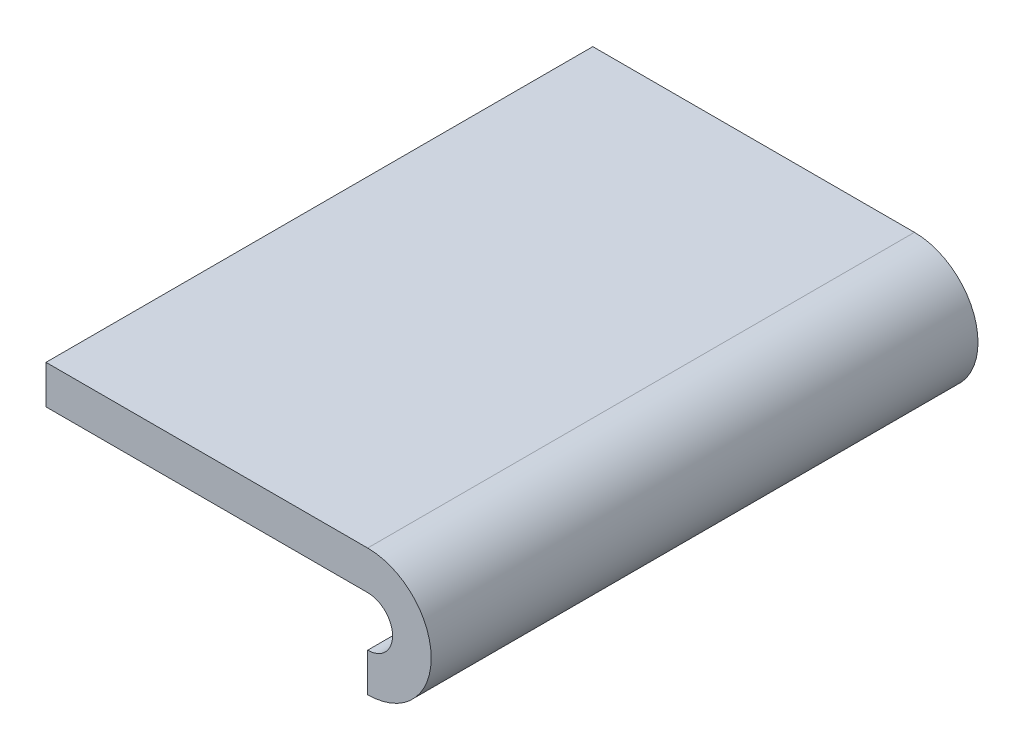
ISO-10303-21;
HEADER;
FILE_DESCRIPTION(('STEP AP214'),'2;1');
FILE_NAME('part.step','',(''),(''),'','','');
FILE_SCHEMA(('AUTOMOTIVE_DESIGN { 1 0 10303 214 1 1 1 1 }'));
ENDSEC;
DATA;
#1=APPLICATION_CONTEXT('core data for automotive mechanical design processes');
#2=APPLICATION_PROTOCOL_DEFINITION('international standard','automotive_design',2000,#1);
#3=PRODUCT_CONTEXT('',#1,'mechanical');
#4=PRODUCT('Part','Part','',(#3));
#5=PRODUCT_RELATED_PRODUCT_CATEGORY('part','',(#4));
#6=PRODUCT_DEFINITION_FORMATION('','',#4);
#7=PRODUCT_DEFINITION_CONTEXT('part definition',#1,'design');
#8=PRODUCT_DEFINITION('design','',#6,#7);
#9=PRODUCT_DEFINITION_SHAPE('','',#8);
#10=(LENGTH_UNIT() NAMED_UNIT(*) SI_UNIT(.MILLI.,.METRE.));
#11=(NAMED_UNIT(*) PLANE_ANGLE_UNIT() SI_UNIT($,.RADIAN.));
#12=(NAMED_UNIT(*) SI_UNIT($,.STERADIAN.) SOLID_ANGLE_UNIT());
#13=UNCERTAINTY_MEASURE_WITH_UNIT(LENGTH_MEASURE(1.E-05),#10,'distance_accuracy_value','');
#14=(GEOMETRIC_REPRESENTATION_CONTEXT(3) GLOBAL_UNCERTAINTY_ASSIGNED_CONTEXT((#13)) GLOBAL_UNIT_ASSIGNED_CONTEXT((#10,
#11,#12)) REPRESENTATION_CONTEXT('',''));
#15=CARTESIAN_POINT('',(0.,0.,0.));
#16=DIRECTION('',(0.,0.,1.));
#17=DIRECTION('',(1.,0.,0.));
#18=AXIS2_PLACEMENT_3D('',#15,#16,#17);
#19=CARTESIAN_POINT('',(0.,0.,170.));
#20=DIRECTION('',(0.,0.,-1.));
#21=DIRECTION('',(-1.,0.,0.));
#22=AXIS2_PLACEMENT_3D('',#19,#20,#21);
#23=CYLINDRICAL_SURFACE('',#22,7.75);
#24=CARTESIAN_POINT('',(0.,0.,0.));
#25=DIRECTION('',(0.,0.,-1.));
#26=DIRECTION('',(-1.,0.,0.));
#27=AXIS2_PLACEMENT_3D('',#24,#25,#26);
#28=CIRCLE('',#27,7.75);
#29=CARTESIAN_POINT('',(0.,7.75,0.));
#30=VERTEX_POINT('',#29);
#31=CARTESIAN_POINT('',(0.,-7.75,0.));
#32=VERTEX_POINT('',#31);
#33=EDGE_CURVE('E118',#30,#32,#28,.T.);
#34=ORIENTED_EDGE('',*,*,#33,.T.);
#35=DIRECTION('',(0.,0.,-1.));
#36=VECTOR('',#35,1.);
#37=CARTESIAN_POINT('',(0.,-7.75,170.));
#38=LINE('',#37,#36);
#39=CARTESIAN_POINT('',(0.,-7.75,170.));
#40=VERTEX_POINT('',#39);
#41=EDGE_CURVE('E11',#40,#32,#38,.T.);
#42=ORIENTED_EDGE('',*,*,#41,.F.);
#43=CARTESIAN_POINT('',(0.,0.,170.));
#44=DIRECTION('',(0.,0.,-1.));
#45=DIRECTION('',(-1.,0.,0.));
#46=AXIS2_PLACEMENT_3D('',#43,#44,#45);
#47=CIRCLE('',#46,7.75);
#48=CARTESIAN_POINT('',(0.,7.75,170.));
#49=VERTEX_POINT('',#48);
#50=EDGE_CURVE('E83',#49,#40,#47,.T.);
#51=ORIENTED_EDGE('',*,*,#50,.F.);
#52=DIRECTION('',(0.,0.,-1.));
#53=VECTOR('',#52,1.);
#54=CARTESIAN_POINT('',(0.,7.75,170.));
#55=LINE('',#54,#53);
#56=EDGE_CURVE('E114',#49,#30,#55,.T.);
#57=ORIENTED_EDGE('',*,*,#56,.T.);
#58=EDGE_LOOP('',(#34,#42,#51,#57));
#59=FACE_BOUND('',#58,.T.);
#60=ADVANCED_FACE('F37',(#59),#23,.F.);
#61=CARTESIAN_POINT('',(0.,-19.75,170.));
#62=DIRECTION('',(-1.,0.,0.));
#63=DIRECTION('',(0.,-1.,0.));
#64=AXIS2_PLACEMENT_3D('',#61,#62,#63);
#65=PLANE('',#64);
#66=DIRECTION('',(0.,1.,0.));
#67=VECTOR('',#66,1.);
#68=CARTESIAN_POINT('',(0.,-19.75,0.));
#69=LINE('',#68,#67);
#70=CARTESIAN_POINT('',(0.,-19.75,0.));
#71=VERTEX_POINT('',#70);
#72=EDGE_CURVE('E121',#71,#32,#69,.T.);
#73=ORIENTED_EDGE('',*,*,#72,.F.);
#74=DIRECTION('',(0.,0.,-1.));
#75=VECTOR('',#74,1.);
#76=CARTESIAN_POINT('',(0.,-19.75,170.));
#77=LINE('',#76,#75);
#78=CARTESIAN_POINT('',(0.,-19.75,170.));
#79=VERTEX_POINT('',#78);
#80=EDGE_CURVE('E45',#79,#71,#77,.T.);
#81=ORIENTED_EDGE('',*,*,#80,.F.);
#82=DIRECTION('',(0.,1.,0.));
#83=VECTOR('',#82,1.);
#84=CARTESIAN_POINT('',(0.,-19.75,170.));
#85=LINE('',#84,#83);
#86=EDGE_CURVE('E191',#79,#40,#85,.T.);
#87=ORIENTED_EDGE('',*,*,#86,.T.);
#88=ORIENTED_EDGE('',*,*,#41,.T.);
#89=EDGE_LOOP('',(#73,#81,#87,#88));
#90=FACE_BOUND('',#89,.T.);
#91=ADVANCED_FACE('F139',(#90),#65,.T.);
#92=CARTESIAN_POINT('',(0.,0.,170.));
#93=DIRECTION('',(0.,0.,-1.));
#94=DIRECTION('',(-1.,0.,0.));
#95=AXIS2_PLACEMENT_3D('',#92,#93,#94);
#96=CYLINDRICAL_SURFACE('',#95,19.75);
#97=CARTESIAN_POINT('',(0.,0.,0.));
#98=DIRECTION('',(0.,0.,1.));
#99=DIRECTION('',(1.,0.,0.));
#100=AXIS2_PLACEMENT_3D('',#97,#98,#99);
#101=CIRCLE('',#100,19.75);
#102=CARTESIAN_POINT('',(0.,19.75,0.));
#103=VERTEX_POINT('',#102);
#104=EDGE_CURVE('E124',#103,#71,#101,.F.);
#105=ORIENTED_EDGE('',*,*,#104,.F.);
#106=DIRECTION('',(0.,0.,-1.));
#107=VECTOR('',#106,1.);
#108=CARTESIAN_POINT('',(0.,19.75,170.));
#109=LINE('',#108,#107);
#110=CARTESIAN_POINT('',(0.,19.75,170.));
#111=VERTEX_POINT('',#110);
#112=EDGE_CURVE('E104',#111,#103,#109,.T.);
#113=ORIENTED_EDGE('',*,*,#112,.F.);
#114=CARTESIAN_POINT('',(0.,0.,170.));
#115=DIRECTION('',(0.,0.,1.));
#116=DIRECTION('',(1.,0.,0.));
#117=AXIS2_PLACEMENT_3D('',#114,#115,#116);
#118=CIRCLE('',#117,19.75);
#119=EDGE_CURVE('E110',#111,#79,#118,.F.);
#120=ORIENTED_EDGE('',*,*,#119,.T.);
#121=ORIENTED_EDGE('',*,*,#80,.T.);
#122=EDGE_LOOP('',(#105,#113,#120,#121));
#123=FACE_BOUND('',#122,.T.);
#124=ADVANCED_FACE('F136',(#123),#96,.T.);
#125=CARTESIAN_POINT('',(-100.,19.75,170.));
#126=DIRECTION('',(0.,1.,0.));
#127=DIRECTION('',(0.,0.,1.));
#128=AXIS2_PLACEMENT_3D('',#125,#126,#127);
#129=PLANE('',#128);
#130=DIRECTION('',(1.,0.,0.));
#131=VECTOR('',#130,1.);
#132=CARTESIAN_POINT('',(-100.,19.75,0.));
#133=LINE('',#132,#131);
#134=CARTESIAN_POINT('',(-100.,19.75,0.));
#135=VERTEX_POINT('',#134);
#136=EDGE_CURVE('E99',#135,#103,#133,.T.);
#137=ORIENTED_EDGE('',*,*,#136,.F.);
#138=DIRECTION('',(0.,0.,-1.));
#139=VECTOR('',#138,1.);
#140=CARTESIAN_POINT('',(-100.,19.75,170.));
#141=LINE('',#140,#139);
#142=CARTESIAN_POINT('',(-100.,19.75,170.));
#143=VERTEX_POINT('',#142);
#144=EDGE_CURVE('E94',#143,#135,#141,.T.);
#145=ORIENTED_EDGE('',*,*,#144,.F.);
#146=DIRECTION('',(1.,0.,0.));
#147=VECTOR('',#146,1.);
#148=CARTESIAN_POINT('',(-100.,19.75,170.));
#149=LINE('',#148,#147);
#150=EDGE_CURVE('E97',#143,#111,#149,.T.);
#151=ORIENTED_EDGE('',*,*,#150,.T.);
#152=ORIENTED_EDGE('',*,*,#112,.T.);
#153=EDGE_LOOP('',(#137,#145,#151,#152));
#154=FACE_BOUND('',#153,.T.);
#155=ADVANCED_FACE('F96',(#154),#129,.T.);
#156=CARTESIAN_POINT('',(-100.,7.75,170.));
#157=DIRECTION('',(-1.,0.,0.));
#158=DIRECTION('',(0.,0.,1.));
#159=AXIS2_PLACEMENT_3D('',#156,#157,#158);
#160=PLANE('',#159);
#161=DIRECTION('',(0.,1.,0.));
#162=VECTOR('',#161,1.);
#163=CARTESIAN_POINT('',(-100.,7.75,0.));
#164=LINE('',#163,#162);
#165=CARTESIAN_POINT('',(-100.,7.75,0.));
#166=VERTEX_POINT('',#165);
#167=EDGE_CURVE('E128',#166,#135,#164,.T.);
#168=ORIENTED_EDGE('',*,*,#167,.F.);
#169=DIRECTION('',(0.,0.,-1.));
#170=VECTOR('',#169,1.);
#171=CARTESIAN_POINT('',(-100.,7.75,170.));
#172=LINE('',#171,#170);
#173=CARTESIAN_POINT('',(-100.,7.75,170.));
#174=VERTEX_POINT('',#173);
#175=EDGE_CURVE('E74',#174,#166,#172,.T.);
#176=ORIENTED_EDGE('',*,*,#175,.F.);
#177=DIRECTION('',(0.,1.,0.));
#178=VECTOR('',#177,1.);
#179=CARTESIAN_POINT('',(-100.,7.75,170.));
#180=LINE('',#179,#178);
#181=EDGE_CURVE('E108',#174,#143,#180,.T.);
#182=ORIENTED_EDGE('',*,*,#181,.T.);
#183=ORIENTED_EDGE('',*,*,#144,.T.);
#184=EDGE_LOOP('',(#168,#176,#182,#183));
#185=FACE_BOUND('',#184,.T.);
#186=ADVANCED_FACE('F112',(#185),#160,.T.);
#187=CARTESIAN_POINT('',(-100.,7.75,170.));
#188=DIRECTION('',(0.,1.,0.));
#189=DIRECTION('',(0.,0.,1.));
#190=AXIS2_PLACEMENT_3D('',#187,#188,#189);
#191=PLANE('',#190);
#192=DIRECTION('',(1.,0.,0.));
#193=VECTOR('',#192,1.);
#194=CARTESIAN_POINT('',(-100.,7.75,0.));
#195=LINE('',#194,#193);
#196=EDGE_CURVE('E77',#166,#30,#195,.T.);
#197=ORIENTED_EDGE('',*,*,#196,.T.);
#198=ORIENTED_EDGE('',*,*,#56,.F.);
#199=DIRECTION('',(1.,0.,0.));
#200=VECTOR('',#199,1.);
#201=CARTESIAN_POINT('',(-100.,7.75,170.));
#202=LINE('',#201,#200);
#203=EDGE_CURVE('E53',#174,#49,#202,.T.);
#204=ORIENTED_EDGE('',*,*,#203,.F.);
#205=ORIENTED_EDGE('',*,*,#175,.T.);
#206=EDGE_LOOP('',(#197,#198,#204,#205));
#207=FACE_BOUND('',#206,.T.);
#208=ADVANCED_FACE('F144',(#207),#191,.F.);
#209=CARTESIAN_POINT('',(0.,0.,170.));
#210=DIRECTION('',(0.,0.,-1.));
#211=DIRECTION('',(-1.,0.,0.));
#212=AXIS2_PLACEMENT_3D('',#209,#210,#211);
#213=PLANE('',#212);
#214=ORIENTED_EDGE('',*,*,#50,.T.);
#215=ORIENTED_EDGE('',*,*,#86,.F.);
#216=ORIENTED_EDGE('',*,*,#119,.F.);
#217=ORIENTED_EDGE('',*,*,#150,.F.);
#218=ORIENTED_EDGE('',*,*,#181,.F.);
#219=ORIENTED_EDGE('',*,*,#203,.T.);
#220=EDGE_LOOP('',(#214,#215,#216,#217,#218,#219));
#221=FACE_BOUND('',#220,.T.);
#222=ADVANCED_FACE('F107',(#221),#213,.F.);
#223=CARTESIAN_POINT('',(0.,0.,0.));
#224=DIRECTION('',(0.,0.,-1.));
#225=DIRECTION('',(-1.,0.,0.));
#226=AXIS2_PLACEMENT_3D('',#223,#224,#225);
#227=PLANE('',#226);
#228=ORIENTED_EDGE('',*,*,#33,.F.);
#229=ORIENTED_EDGE('',*,*,#196,.F.);
#230=ORIENTED_EDGE('',*,*,#167,.T.);
#231=ORIENTED_EDGE('',*,*,#136,.T.);
#232=ORIENTED_EDGE('',*,*,#104,.T.);
#233=ORIENTED_EDGE('',*,*,#72,.T.);
#234=EDGE_LOOP('',(#228,#229,#230,#231,#232,#233));
#235=FACE_BOUND('',#234,.T.);
#236=ADVANCED_FACE('F142',(#235),#227,.T.);
#237=CLOSED_SHELL('',(#60,#91,#124,#155,#186,#208,#222,#236));
#238=MANIFOLD_SOLID_BREP('B2',#237);
#239=ADVANCED_BREP_SHAPE_REPRESENTATION('',(#18,#238),#14);
#240=SHAPE_DEFINITION_REPRESENTATION(#9,#239);
ENDSEC;
END-ISO-10303-21;
